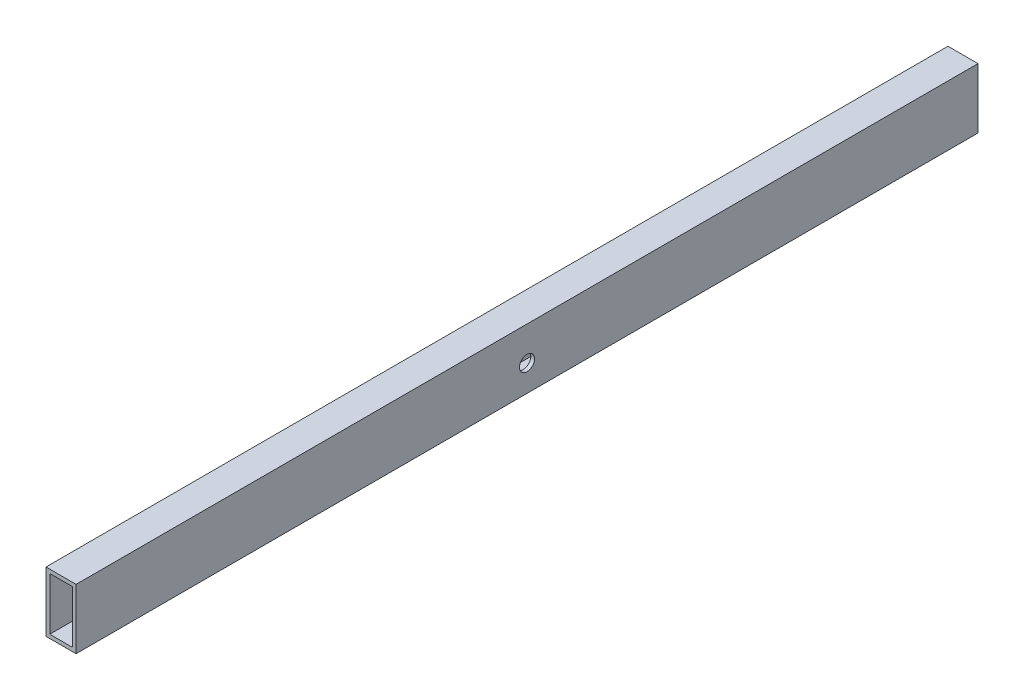
ISO-10303-21;
HEADER;
FILE_DESCRIPTION(('STEP AP214'),'2;1');
FILE_NAME('part.step','',(''),(''),'','','');
FILE_SCHEMA(('AUTOMOTIVE_DESIGN { 1 0 10303 214 1 1 1 1 }'));
ENDSEC;
DATA;
#1=APPLICATION_CONTEXT('core data for automotive mechanical design processes');
#2=APPLICATION_PROTOCOL_DEFINITION('international standard','automotive_design',2000,#1);
#3=PRODUCT_CONTEXT('',#1,'mechanical');
#4=PRODUCT('Part','Part','',(#3));
#5=PRODUCT_RELATED_PRODUCT_CATEGORY('part','',(#4));
#6=PRODUCT_DEFINITION_FORMATION('','',#4);
#7=PRODUCT_DEFINITION_CONTEXT('part definition',#1,'design');
#8=PRODUCT_DEFINITION('design','',#6,#7);
#9=PRODUCT_DEFINITION_SHAPE('','',#8);
#10=(LENGTH_UNIT() NAMED_UNIT(*) SI_UNIT(.MILLI.,.METRE.));
#11=(NAMED_UNIT(*) PLANE_ANGLE_UNIT() SI_UNIT($,.RADIAN.));
#12=(NAMED_UNIT(*) SI_UNIT($,.STERADIAN.) SOLID_ANGLE_UNIT());
#13=UNCERTAINTY_MEASURE_WITH_UNIT(LENGTH_MEASURE(1.E-05),#10,'distance_accuracy_value','');
#14=(GEOMETRIC_REPRESENTATION_CONTEXT(3) GLOBAL_UNCERTAINTY_ASSIGNED_CONTEXT((#13)) GLOBAL_UNIT_ASSIGNED_CONTEXT((#10,
#11,#12)) REPRESENTATION_CONTEXT('',''));
#15=CARTESIAN_POINT('',(0.,0.,0.));
#16=DIRECTION('',(0.,0.,1.));
#17=DIRECTION('',(1.,0.,0.));
#18=AXIS2_PLACEMENT_3D('',#15,#16,#17);
#19=CARTESIAN_POINT('',(0.,0.,381.));
#20=DIRECTION('',(0.,0.,1.));
#21=DIRECTION('',(1.,0.,0.));
#22=AXIS2_PLACEMENT_3D('',#19,#20,#21);
#23=PLANE('',#22);
#24=DIRECTION('',(0.,-1.,0.));
#25=VECTOR('',#24,1.);
#26=CARTESIAN_POINT('',(-10.7985455953781,17.7002808264888,381.));
#27=LINE('',#26,#25);
#28=CARTESIAN_POINT('',(-10.7985455953781,17.7002808264888,381.));
#29=VERTEX_POINT('',#28);
#30=CARTESIAN_POINT('',(-10.7985455953781,-33.0997191735112,381.));
#31=VERTEX_POINT('',#30);
#32=EDGE_CURVE('E137',#29,#31,#27,.T.);
#33=ORIENTED_EDGE('',*,*,#32,.T.);
#34=DIRECTION('',(1.,0.,0.));
#35=VECTOR('',#34,1.);
#36=CARTESIAN_POINT('',(-10.7985455953781,-33.0997191735112,381.));
#37=LINE('',#36,#35);
#38=CARTESIAN_POINT('',(14.6014544046219,-33.0997191735112,381.));
#39=VERTEX_POINT('',#38);
#40=EDGE_CURVE('E140',#31,#39,#37,.T.);
#41=ORIENTED_EDGE('',*,*,#40,.T.);
#42=DIRECTION('',(0.,1.,0.));
#43=VECTOR('',#42,1.);
#44=CARTESIAN_POINT('',(14.6014544046219,17.7002808264888,381.));
#45=LINE('',#44,#43);
#46=CARTESIAN_POINT('',(14.6014544046219,17.7002808264888,381.));
#47=VERTEX_POINT('',#46);
#48=EDGE_CURVE('E143',#39,#47,#45,.T.);
#49=ORIENTED_EDGE('',*,*,#48,.T.);
#50=DIRECTION('',(-1.,0.,0.));
#51=VECTOR('',#50,1.);
#52=CARTESIAN_POINT('',(-10.7985455953781,17.7002808264888,381.));
#53=LINE('',#52,#51);
#54=EDGE_CURVE('E145',#47,#29,#53,.T.);
#55=ORIENTED_EDGE('',*,*,#54,.T.);
#56=EDGE_LOOP('',(#33,#41,#49,#55));
#57=FACE_BOUND('',#56,.T.);
#58=DIRECTION('',(1.,0.,0.));
#59=VECTOR('',#58,1.);
#60=CARTESIAN_POINT('',(-7.62354559537807,-29.9247191735112,381.));
#61=LINE('',#60,#59);
#62=CARTESIAN_POINT('',(-7.62354559537807,-29.9247191735112,381.));
#63=VERTEX_POINT('',#62);
#64=CARTESIAN_POINT('',(11.4264544046219,-29.9247191735112,381.));
#65=VERTEX_POINT('',#64);
#66=EDGE_CURVE('E107',#63,#65,#61,.T.);
#67=ORIENTED_EDGE('',*,*,#66,.F.);
#68=DIRECTION('',(0.,-1.,0.));
#69=VECTOR('',#68,1.);
#70=CARTESIAN_POINT('',(-7.62354559537807,14.5252808264888,381.));
#71=LINE('',#70,#69);
#72=CARTESIAN_POINT('',(-7.62354559537807,14.5252808264888,381.));
#73=VERTEX_POINT('',#72);
#74=EDGE_CURVE('E99',#73,#63,#71,.T.);
#75=ORIENTED_EDGE('',*,*,#74,.F.);
#76=DIRECTION('',(-1.,0.,0.));
#77=VECTOR('',#76,1.);
#78=CARTESIAN_POINT('',(-7.62354559537807,14.5252808264888,381.));
#79=LINE('',#78,#77);
#80=CARTESIAN_POINT('',(11.4264544046219,14.5252808264888,381.));
#81=VERTEX_POINT('',#80);
#82=EDGE_CURVE('E121',#81,#73,#79,.T.);
#83=ORIENTED_EDGE('',*,*,#82,.F.);
#84=DIRECTION('',(0.,1.,0.));
#85=VECTOR('',#84,1.);
#86=CARTESIAN_POINT('',(11.4264544046219,14.5252808264888,381.));
#87=LINE('',#86,#85);
#88=EDGE_CURVE('E119',#65,#81,#87,.T.);
#89=ORIENTED_EDGE('',*,*,#88,.F.);
#90=EDGE_LOOP('',(#67,#75,#83,#89));
#91=FACE_BOUND('',#90,.T.);
#92=ADVANCED_FACE('F33',(#57,#91),#23,.T.);
#93=CARTESIAN_POINT('',(0.,0.,-381.));
#94=DIRECTION('',(0.,0.,1.));
#95=DIRECTION('',(1.,0.,0.));
#96=AXIS2_PLACEMENT_3D('',#93,#94,#95);
#97=PLANE('',#96);
#98=DIRECTION('',(0.,-1.,0.));
#99=VECTOR('',#98,1.);
#100=CARTESIAN_POINT('',(-10.7985455953781,17.7002808264888,-381.));
#101=LINE('',#100,#99);
#102=CARTESIAN_POINT('',(-10.7985455953781,17.7002808264888,-381.));
#103=VERTEX_POINT('',#102);
#104=CARTESIAN_POINT('',(-10.7985455953781,-33.0997191735112,-381.));
#105=VERTEX_POINT('',#104);
#106=EDGE_CURVE('E115',#103,#105,#101,.T.);
#107=ORIENTED_EDGE('',*,*,#106,.F.);
#108=DIRECTION('',(-1.,0.,0.));
#109=VECTOR('',#108,1.);
#110=CARTESIAN_POINT('',(-10.7985455953781,17.7002808264888,-381.));
#111=LINE('',#110,#109);
#112=CARTESIAN_POINT('',(14.6014544046219,17.7002808264888,-381.));
#113=VERTEX_POINT('',#112);
#114=EDGE_CURVE('E141',#113,#103,#111,.T.);
#115=ORIENTED_EDGE('',*,*,#114,.F.);
#116=DIRECTION('',(0.,1.,0.));
#117=VECTOR('',#116,1.);
#118=CARTESIAN_POINT('',(14.6014544046219,17.7002808264888,-381.));
#119=LINE('',#118,#117);
#120=CARTESIAN_POINT('',(14.6014544046219,-33.0997191735112,-381.));
#121=VERTEX_POINT('',#120);
#122=EDGE_CURVE('E152',#121,#113,#119,.T.);
#123=ORIENTED_EDGE('',*,*,#122,.F.);
#124=DIRECTION('',(1.,0.,0.));
#125=VECTOR('',#124,1.);
#126=CARTESIAN_POINT('',(-10.7985455953781,-33.0997191735112,-381.));
#127=LINE('',#126,#125);
#128=EDGE_CURVE('E150',#105,#121,#127,.T.);
#129=ORIENTED_EDGE('',*,*,#128,.F.);
#130=EDGE_LOOP('',(#107,#115,#123,#129));
#131=FACE_BOUND('',#130,.T.);
#132=DIRECTION('',(0.,-1.,0.));
#133=VECTOR('',#132,1.);
#134=CARTESIAN_POINT('',(-7.62354559537807,14.5252808264888,-381.));
#135=LINE('',#134,#133);
#136=CARTESIAN_POINT('',(-7.62354559537807,14.5252808264888,-381.));
#137=VERTEX_POINT('',#136);
#138=CARTESIAN_POINT('',(-7.62354559537807,-29.9247191735112,-381.));
#139=VERTEX_POINT('',#138);
#140=EDGE_CURVE('E57',#137,#139,#135,.T.);
#141=ORIENTED_EDGE('',*,*,#140,.T.);
#142=DIRECTION('',(1.,0.,0.));
#143=VECTOR('',#142,1.);
#144=CARTESIAN_POINT('',(-7.62354559537807,-29.9247191735112,-381.));
#145=LINE('',#144,#143);
#146=CARTESIAN_POINT('',(11.4264544046219,-29.9247191735112,-381.));
#147=VERTEX_POINT('',#146);
#148=EDGE_CURVE('E114',#139,#147,#145,.T.);
#149=ORIENTED_EDGE('',*,*,#148,.T.);
#150=DIRECTION('',(0.,1.,0.));
#151=VECTOR('',#150,1.);
#152=CARTESIAN_POINT('',(11.4264544046219,14.5252808264888,-381.));
#153=LINE('',#152,#151);
#154=CARTESIAN_POINT('',(11.4264544046219,14.5252808264888,-381.));
#155=VERTEX_POINT('',#154);
#156=EDGE_CURVE('E129',#147,#155,#153,.T.);
#157=ORIENTED_EDGE('',*,*,#156,.T.);
#158=DIRECTION('',(-1.,0.,0.));
#159=VECTOR('',#158,1.);
#160=CARTESIAN_POINT('',(-7.62354559537807,14.5252808264888,-381.));
#161=LINE('',#160,#159);
#162=EDGE_CURVE('E108',#155,#137,#161,.T.);
#163=ORIENTED_EDGE('',*,*,#162,.T.);
#164=EDGE_LOOP('',(#141,#149,#157,#163));
#165=FACE_BOUND('',#164,.T.);
#166=ADVANCED_FACE('F171',(#131,#165),#97,.F.);
#167=CARTESIAN_POINT('',(-10.7985455953781,17.7002808264888,381.));
#168=DIRECTION('',(1.,0.,0.));
#169=DIRECTION('',(0.,1.,0.));
#170=AXIS2_PLACEMENT_3D('',#167,#168,#169);
#171=PLANE('',#170);
#172=CARTESIAN_POINT('',(-10.7985455953781,-10.8747191735112,0.));
#173=DIRECTION('',(1.,0.,0.));
#174=DIRECTION('',(0.,1.,0.));
#175=AXIS2_PLACEMENT_3D('',#172,#173,#174);
#176=CIRCLE('',#175,6.35);
#177=CARTESIAN_POINT('',(-10.7985455953781,-4.52471917351123,0.));
#178=VERTEX_POINT('',#177);
#179=EDGE_CURVE('E212',#178,#178,#176,.T.);
#180=ORIENTED_EDGE('',*,*,#179,.T.);
#181=EDGE_LOOP('',(#180));
#182=FACE_BOUND('',#181,.T.);
#183=ORIENTED_EDGE('',*,*,#106,.T.);
#184=DIRECTION('',(0.,0.,-1.));
#185=VECTOR('',#184,1.);
#186=CARTESIAN_POINT('',(-10.7985455953781,-33.0997191735112,381.));
#187=LINE('',#186,#185);
#188=EDGE_CURVE('E11',#31,#105,#187,.T.);
#189=ORIENTED_EDGE('',*,*,#188,.F.);
#190=ORIENTED_EDGE('',*,*,#32,.F.);
#191=DIRECTION('',(0.,0.,-1.));
#192=VECTOR('',#191,1.);
#193=CARTESIAN_POINT('',(-10.7985455953781,17.7002808264888,381.));
#194=LINE('',#193,#192);
#195=EDGE_CURVE('E147',#29,#103,#194,.T.);
#196=ORIENTED_EDGE('',*,*,#195,.T.);
#197=EDGE_LOOP('',(#183,#189,#190,#196));
#198=FACE_BOUND('',#197,.T.);
#199=ADVANCED_FACE('F35',(#182,#198),#171,.F.);
#200=CARTESIAN_POINT('',(-10.7985455953781,-33.0997191735112,381.));
#201=DIRECTION('',(0.,1.,0.));
#202=DIRECTION('',(0.,0.,1.));
#203=AXIS2_PLACEMENT_3D('',#200,#201,#202);
#204=PLANE('',#203);
#205=ORIENTED_EDGE('',*,*,#128,.T.);
#206=DIRECTION('',(0.,0.,-1.));
#207=VECTOR('',#206,1.);
#208=CARTESIAN_POINT('',(14.6014544046219,-33.0997191735112,381.));
#209=LINE('',#208,#207);
#210=EDGE_CURVE('E42',#39,#121,#209,.T.);
#211=ORIENTED_EDGE('',*,*,#210,.F.);
#212=ORIENTED_EDGE('',*,*,#40,.F.);
#213=ORIENTED_EDGE('',*,*,#188,.T.);
#214=EDGE_LOOP('',(#205,#211,#212,#213));
#215=FACE_BOUND('',#214,.T.);
#216=ADVANCED_FACE('F181',(#215),#204,.F.);
#217=CARTESIAN_POINT('',(14.6014544046219,17.7002808264888,381.));
#218=DIRECTION('',(-1.,0.,0.));
#219=DIRECTION('',(0.,-1.,0.));
#220=AXIS2_PLACEMENT_3D('',#217,#218,#219);
#221=PLANE('',#220);
#222=CARTESIAN_POINT('',(14.6014544046219,-10.8747191735112,0.));
#223=DIRECTION('',(1.,0.,0.));
#224=DIRECTION('',(0.,1.,0.));
#225=AXIS2_PLACEMENT_3D('',#222,#223,#224);
#226=CIRCLE('',#225,6.35);
#227=CARTESIAN_POINT('',(14.6014544046219,-4.52471917351122,0.));
#228=VERTEX_POINT('',#227);
#229=EDGE_CURVE('E214',#228,#228,#226,.T.);
#230=ORIENTED_EDGE('',*,*,#229,.F.);
#231=EDGE_LOOP('',(#230));
#232=FACE_BOUND('',#231,.T.);
#233=ORIENTED_EDGE('',*,*,#122,.T.);
#234=DIRECTION('',(0.,0.,-1.));
#235=VECTOR('',#234,1.);
#236=CARTESIAN_POINT('',(14.6014544046219,17.7002808264888,381.));
#237=LINE('',#236,#235);
#238=EDGE_CURVE('E157',#47,#113,#237,.T.);
#239=ORIENTED_EDGE('',*,*,#238,.F.);
#240=ORIENTED_EDGE('',*,*,#48,.F.);
#241=ORIENTED_EDGE('',*,*,#210,.T.);
#242=EDGE_LOOP('',(#233,#239,#240,#241));
#243=FACE_BOUND('',#242,.T.);
#244=ADVANCED_FACE('F165',(#232,#243),#221,.F.);
#245=CARTESIAN_POINT('',(-10.7985455953781,17.7002808264888,381.));
#246=DIRECTION('',(0.,-1.,0.));
#247=DIRECTION('',(0.,0.,-1.));
#248=AXIS2_PLACEMENT_3D('',#245,#246,#247);
#249=PLANE('',#248);
#250=ORIENTED_EDGE('',*,*,#114,.T.);
#251=ORIENTED_EDGE('',*,*,#195,.F.);
#252=ORIENTED_EDGE('',*,*,#54,.F.);
#253=ORIENTED_EDGE('',*,*,#238,.T.);
#254=EDGE_LOOP('',(#250,#251,#252,#253));
#255=FACE_BOUND('',#254,.T.);
#256=ADVANCED_FACE('F175',(#255),#249,.F.);
#257=CARTESIAN_POINT('',(-7.62354559537807,14.5252808264888,381.));
#258=DIRECTION('',(1.,0.,0.));
#259=DIRECTION('',(0.,0.,-1.));
#260=AXIS2_PLACEMENT_3D('',#257,#258,#259);
#261=PLANE('',#260);
#262=CARTESIAN_POINT('',(-7.62354559537807,-10.8747191735112,0.));
#263=DIRECTION('',(1.,0.,0.));
#264=DIRECTION('',(0.,0.,-1.));
#265=AXIS2_PLACEMENT_3D('',#262,#263,#264);
#266=CIRCLE('',#265,6.35);
#267=CARTESIAN_POINT('',(-7.62354559537807,-10.8747191735112,-6.35));
#268=VERTEX_POINT('',#267);
#269=EDGE_CURVE('E127',#268,#268,#266,.T.);
#270=ORIENTED_EDGE('',*,*,#269,.F.);
#271=EDGE_LOOP('',(#270));
#272=FACE_BOUND('',#271,.T.);
#273=ORIENTED_EDGE('',*,*,#140,.F.);
#274=DIRECTION('',(0.,0.,-1.));
#275=VECTOR('',#274,1.);
#276=CARTESIAN_POINT('',(-7.62354559537807,14.5252808264888,381.));
#277=LINE('',#276,#275);
#278=EDGE_CURVE('E103',#73,#137,#277,.T.);
#279=ORIENTED_EDGE('',*,*,#278,.F.);
#280=ORIENTED_EDGE('',*,*,#74,.T.);
#281=DIRECTION('',(0.,0.,-1.));
#282=VECTOR('',#281,1.);
#283=CARTESIAN_POINT('',(-7.62354559537807,-29.9247191735112,381.));
#284=LINE('',#283,#282);
#285=EDGE_CURVE('E102',#63,#139,#284,.T.);
#286=ORIENTED_EDGE('',*,*,#285,.T.);
#287=EDGE_LOOP('',(#273,#279,#280,#286));
#288=FACE_BOUND('',#287,.T.);
#289=ADVANCED_FACE('F101',(#272,#288),#261,.T.);
#290=CARTESIAN_POINT('',(-7.62354559537807,-29.9247191735112,381.));
#291=DIRECTION('',(0.,1.,0.));
#292=DIRECTION('',(-1.,0.,0.));
#293=AXIS2_PLACEMENT_3D('',#290,#291,#292);
#294=PLANE('',#293);
#295=ORIENTED_EDGE('',*,*,#148,.F.);
#296=ORIENTED_EDGE('',*,*,#285,.F.);
#297=ORIENTED_EDGE('',*,*,#66,.T.);
#298=DIRECTION('',(0.,0.,-1.));
#299=VECTOR('',#298,1.);
#300=CARTESIAN_POINT('',(11.4264544046219,-29.9247191735112,381.));
#301=LINE('',#300,#299);
#302=EDGE_CURVE('E116',#65,#147,#301,.T.);
#303=ORIENTED_EDGE('',*,*,#302,.T.);
#304=EDGE_LOOP('',(#295,#296,#297,#303));
#305=FACE_BOUND('',#304,.T.);
#306=ADVANCED_FACE('F111',(#305),#294,.T.);
#307=CARTESIAN_POINT('',(11.4264544046219,14.5252808264888,381.));
#308=DIRECTION('',(-1.,0.,0.));
#309=DIRECTION('',(0.,0.,1.));
#310=AXIS2_PLACEMENT_3D('',#307,#308,#309);
#311=PLANE('',#310);
#312=CARTESIAN_POINT('',(11.4264544046219,-10.8747191735112,0.));
#313=DIRECTION('',(-1.,0.,0.));
#314=DIRECTION('',(0.,0.,1.));
#315=AXIS2_PLACEMENT_3D('',#312,#313,#314);
#316=CIRCLE('',#315,6.35);
#317=CARTESIAN_POINT('',(11.4264544046219,-10.8747191735112,6.35));
#318=VERTEX_POINT('',#317);
#319=EDGE_CURVE('E37',#318,#318,#316,.T.);
#320=ORIENTED_EDGE('',*,*,#319,.F.);
#321=EDGE_LOOP('',(#320));
#322=FACE_BOUND('',#321,.T.);
#323=ORIENTED_EDGE('',*,*,#156,.F.);
#324=ORIENTED_EDGE('',*,*,#302,.F.);
#325=ORIENTED_EDGE('',*,*,#88,.T.);
#326=DIRECTION('',(0.,0.,-1.));
#327=VECTOR('',#326,1.);
#328=CARTESIAN_POINT('',(11.4264544046219,14.5252808264888,381.));
#329=LINE('',#328,#327);
#330=EDGE_CURVE('E49',#81,#155,#329,.T.);
#331=ORIENTED_EDGE('',*,*,#330,.T.);
#332=EDGE_LOOP('',(#323,#324,#325,#331));
#333=FACE_BOUND('',#332,.T.);
#334=ADVANCED_FACE('F207',(#322,#333),#311,.T.);
#335=CARTESIAN_POINT('',(-7.62354559537807,14.5252808264888,381.));
#336=DIRECTION('',(0.,-1.,0.));
#337=DIRECTION('',(0.,0.,-1.));
#338=AXIS2_PLACEMENT_3D('',#335,#336,#337);
#339=PLANE('',#338);
#340=ORIENTED_EDGE('',*,*,#162,.F.);
#341=ORIENTED_EDGE('',*,*,#330,.F.);
#342=ORIENTED_EDGE('',*,*,#82,.T.);
#343=ORIENTED_EDGE('',*,*,#278,.T.);
#344=EDGE_LOOP('',(#340,#341,#342,#343));
#345=FACE_BOUND('',#344,.T.);
#346=ADVANCED_FACE('F227',(#345),#339,.T.);
#347=CARTESIAN_POINT('',(-10.7985455953781,-10.8747191735112,0.));
#348=DIRECTION('',(1.,0.,0.));
#349=DIRECTION('',(0.,1.,0.));
#350=AXIS2_PLACEMENT_3D('',#347,#348,#349);
#351=CYLINDRICAL_SURFACE('',#350,6.35);
#352=ORIENTED_EDGE('',*,*,#319,.T.);
#353=EDGE_LOOP('',(#352));
#354=FACE_BOUND('',#353,.T.);
#355=ORIENTED_EDGE('',*,*,#229,.T.);
#356=EDGE_LOOP('',(#355));
#357=FACE_BOUND('',#356,.T.);
#358=ADVANCED_FACE('F222',(#354,#357),#351,.F.);
#359=ORIENTED_EDGE('',*,*,#269,.T.);
#360=EDGE_LOOP('',(#359));
#361=FACE_BOUND('',#360,.T.);
#362=ORIENTED_EDGE('',*,*,#179,.F.);
#363=EDGE_LOOP('',(#362));
#364=FACE_BOUND('',#363,.T.);
#365=ADVANCED_FACE('F220',(#361,#364),#351,.F.);
#366=CLOSED_SHELL('',(#92,#166,#199,#216,#244,#256,#289,#306,#334,#346,#358,#365));
#367=MANIFOLD_SOLID_BREP('B2',#366);
#368=ADVANCED_BREP_SHAPE_REPRESENTATION('',(#18,#367),#14);
#369=SHAPE_DEFINITION_REPRESENTATION(#9,#368);
ENDSEC;
END-ISO-10303-21;
